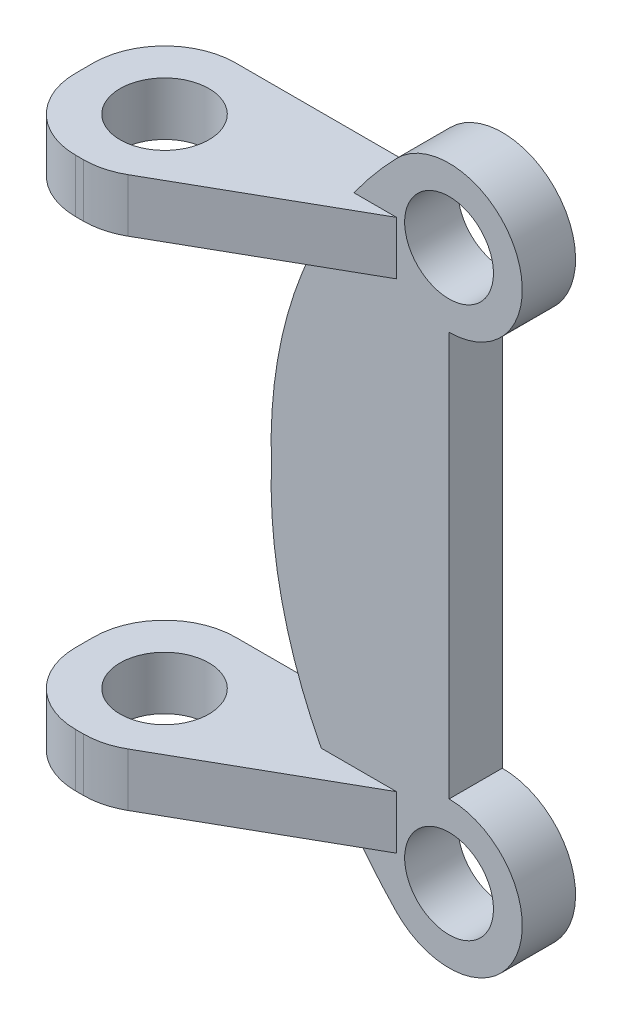
ISO-10303-21;
HEADER;
FILE_DESCRIPTION(('STEP AP214'),'2;1');
FILE_NAME('part.step','',(''),(''),'','','');
FILE_SCHEMA(('AUTOMOTIVE_DESIGN { 1 0 10303 214 1 1 1 1 }'));
ENDSEC;
DATA;
#1=APPLICATION_CONTEXT('core data for automotive mechanical design processes');
#2=APPLICATION_PROTOCOL_DEFINITION('international standard','automotive_design',2000,#1);
#3=PRODUCT_CONTEXT('',#1,'mechanical');
#4=PRODUCT('Part','Part','',(#3));
#5=PRODUCT_RELATED_PRODUCT_CATEGORY('part','',(#4));
#6=PRODUCT_DEFINITION_FORMATION('','',#4);
#7=PRODUCT_DEFINITION_CONTEXT('part definition',#1,'design');
#8=PRODUCT_DEFINITION('design','',#6,#7);
#9=PRODUCT_DEFINITION_SHAPE('','',#8);
#10=(LENGTH_UNIT() NAMED_UNIT(*) SI_UNIT(.MILLI.,.METRE.));
#11=(NAMED_UNIT(*) PLANE_ANGLE_UNIT() SI_UNIT($,.RADIAN.));
#12=(NAMED_UNIT(*) SI_UNIT($,.STERADIAN.) SOLID_ANGLE_UNIT());
#13=UNCERTAINTY_MEASURE_WITH_UNIT(LENGTH_MEASURE(1.E-05),#10,'distance_accuracy_value','');
#14=(GEOMETRIC_REPRESENTATION_CONTEXT(3) GLOBAL_UNCERTAINTY_ASSIGNED_CONTEXT((#13)) GLOBAL_UNIT_ASSIGNED_CONTEXT((#10,
#11,#12)) REPRESENTATION_CONTEXT('',''));
#15=CARTESIAN_POINT('',(0.,0.,0.));
#16=DIRECTION('',(0.,0.,1.));
#17=DIRECTION('',(1.,0.,0.));
#18=AXIS2_PLACEMENT_3D('',#15,#16,#17);
#19=CARTESIAN_POINT('',(0.,0.,3.));
#20=DIRECTION('',(0.,0.,1.));
#21=DIRECTION('',(1.,0.,0.));
#22=AXIS2_PLACEMENT_3D('',#19,#20,#21);
#23=PLANE('',#22);
#24=CARTESIAN_POINT('',(3.49295233502644,-16.0871406371406,3.));
#25=DIRECTION('',(0.,0.,1.));
#26=DIRECTION('',(1.,0.,0.));
#27=AXIS2_PLACEMENT_3D('',#24,#25,#26);
#28=CIRCLE('',#27,2.5);
#29=CARTESIAN_POINT('',(5.99295233502645,-16.0871406371406,3.));
#30=VERTEX_POINT('',#29);
#31=EDGE_CURVE('E345',#30,#30,#28,.T.);
#32=ORIENTED_EDGE('',*,*,#31,.F.);
#33=EDGE_LOOP('',(#32));
#34=FACE_BOUND('',#33,.T.);
#35=CARTESIAN_POINT('',(3.49295233502644,14.9128593628594,3.));
#36=DIRECTION('',(0.,0.,1.));
#37=DIRECTION('',(1.,0.,0.));
#38=AXIS2_PLACEMENT_3D('',#35,#36,#37);
#39=CIRCLE('',#38,2.5);
#40=CARTESIAN_POINT('',(5.99295233502645,14.9128593628594,3.));
#41=VERTEX_POINT('',#40);
#42=EDGE_CURVE('E348',#41,#41,#39,.T.);
#43=ORIENTED_EDGE('',*,*,#42,.F.);
#44=EDGE_LOOP('',(#43));
#45=FACE_BOUND('',#44,.T.);
#46=DIRECTION('',(0.,1.,0.));
#47=VECTOR('',#46,1.);
#48=CARTESIAN_POINT('',(0.534883590771744,-16.0871406371406,3.));
#49=LINE('',#48,#47);
#50=CARTESIAN_POINT('',(0.534883590771744,-16.0871406371407,3.));
#51=VERTEX_POINT('',#50);
#52=CARTESIAN_POINT('',(0.534883590771741,-13.0871406371406,3.));
#53=VERTEX_POINT('',#52);
#54=EDGE_CURVE('E48',#51,#53,#49,.T.);
#55=ORIENTED_EDGE('',*,*,#54,.F.);
#56=DIRECTION('',(-1.,0.,0.));
#57=VECTOR('',#56,1.);
#58=CARTESIAN_POINT('',(0.,-16.0871406371406,3.));
#59=LINE('',#58,#57);
#60=CARTESIAN_POINT('',(-1.86181712494155,-16.0871406371407,3.));
#61=VERTEX_POINT('',#60);
#62=EDGE_CURVE('E206',#51,#61,#59,.T.);
#63=ORIENTED_EDGE('',*,*,#62,.T.);
#64=CARTESIAN_POINT('',(18.4745416203069,-1.54642150139809,3.));
#65=DIRECTION('',(0.,0.,1.));
#66=DIRECTION('',(1.,0.,0.));
#67=AXIS2_PLACEMENT_3D('',#64,#65,#66);
#68=CIRCLE('',#67,24.9999999999999);
#69=CARTESIAN_POINT('',(0.534883590771748,-18.9581609258016,3.));
#70=VERTEX_POINT('',#69);
#71=EDGE_CURVE('E337',#70,#61,#68,.F.);
#72=ORIENTED_EDGE('',*,*,#71,.F.);
#73=CARTESIAN_POINT('',(3.49295233502644,-16.0871406371406,3.));
#74=DIRECTION('',(0.,0.,1.));
#75=DIRECTION('',(1.,0.,0.));
#76=AXIS2_PLACEMENT_3D('',#73,#74,#75);
#77=CIRCLE('',#76,4.12224795392507);
#78=CARTESIAN_POINT('',(3.49295233502644,-11.9648926832156,3.));
#79=VERTEX_POINT('',#78);
#80=EDGE_CURVE('E340',#70,#79,#77,.T.);
#81=ORIENTED_EDGE('',*,*,#80,.T.);
#82=DIRECTION('',(0.,-1.,0.));
#83=VECTOR('',#82,1.);
#84=CARTESIAN_POINT('',(3.49295233502644,0.,3.));
#85=LINE('',#84,#83);
#86=CARTESIAN_POINT('',(3.49295233502644,10.7906114089343,3.));
#87=VERTEX_POINT('',#86);
#88=EDGE_CURVE('E342',#87,#79,#85,.T.);
#89=ORIENTED_EDGE('',*,*,#88,.F.);
#90=CARTESIAN_POINT('',(3.49295233502644,14.9128593628594,3.));
#91=DIRECTION('',(0.,0.,1.));
#92=DIRECTION('',(1.,0.,0.));
#93=AXIS2_PLACEMENT_3D('',#90,#91,#92);
#94=CIRCLE('',#93,4.12224795392507);
#95=CARTESIAN_POINT('',(0.534883590771744,17.7838796515203,3.));
#96=VERTEX_POINT('',#95);
#97=EDGE_CURVE('E328',#96,#87,#94,.F.);
#98=ORIENTED_EDGE('',*,*,#97,.F.);
#99=CARTESIAN_POINT('',(18.4745416203069,0.372140227116786,3.));
#100=DIRECTION('',(0.,0.,1.));
#101=DIRECTION('',(1.,0.,0.));
#102=AXIS2_PLACEMENT_3D('',#99,#100,#101);
#103=CIRCLE('',#102,24.9999999999999);
#104=CARTESIAN_POINT('',(-1.86181712494155,14.9128593628593,3.));
#105=VERTEX_POINT('',#104);
#106=EDGE_CURVE('E333',#96,#105,#103,.T.);
#107=ORIENTED_EDGE('',*,*,#106,.T.);
#108=DIRECTION('',(1.,0.,0.));
#109=VECTOR('',#108,1.);
#110=CARTESIAN_POINT('',(0.,14.9128593628594,3.));
#111=LINE('',#110,#109);
#112=CARTESIAN_POINT('',(0.534883590771708,14.9128593628594,3.));
#113=VERTEX_POINT('',#112);
#114=EDGE_CURVE('E322',#105,#113,#111,.T.);
#115=ORIENTED_EDGE('',*,*,#114,.T.);
#116=DIRECTION('',(0.,-1.,0.));
#117=VECTOR('',#116,1.);
#118=CARTESIAN_POINT('',(0.534883590771708,14.9128593628594,3.));
#119=LINE('',#118,#117);
#120=CARTESIAN_POINT('',(0.534883590771712,11.9128593628593,3.));
#121=VERTEX_POINT('',#120);
#122=EDGE_CURVE('E283',#113,#121,#119,.T.);
#123=ORIENTED_EDGE('',*,*,#122,.T.);
#124=DIRECTION('',(1.,0.,0.));
#125=VECTOR('',#124,1.);
#126=CARTESIAN_POINT('',(0.,11.9128593628594,3.));
#127=LINE('',#126,#125);
#128=CARTESIAN_POINT('',(-3.70228867236339,11.9128593628593,3.));
#129=VERTEX_POINT('',#128);
#130=EDGE_CURVE('E316',#129,#121,#127,.T.);
#131=ORIENTED_EDGE('',*,*,#130,.F.);
#132=CARTESIAN_POINT('',(-6.50704720473508,-0.587140637140656,3.));
#133=VERTEX_POINT('',#132);
#134=EDGE_CURVE('E331',#129,#133,#103,.T.);
#135=ORIENTED_EDGE('',*,*,#134,.T.);
#136=CARTESIAN_POINT('',(-3.70228867236339,-13.0871406371407,3.));
#137=VERTEX_POINT('',#136);
#138=EDGE_CURVE('E336',#137,#133,#68,.F.);
#139=ORIENTED_EDGE('',*,*,#138,.F.);
#140=DIRECTION('',(-1.,0.,0.));
#141=VECTOR('',#140,1.);
#142=CARTESIAN_POINT('',(0.,-13.0871406371406,3.));
#143=LINE('',#142,#141);
#144=EDGE_CURVE('E53',#53,#137,#143,.T.);
#145=ORIENTED_EDGE('',*,*,#144,.F.);
#146=EDGE_LOOP('',(#55,#63,#72,#81,#89,#98,#107,#115,#123,#131,#135,#139,#145));
#147=FACE_BOUND('',#146,.T.);
#148=ADVANCED_FACE('F33',(#34,#45,#147),#23,.T.);
#149=CARTESIAN_POINT('',(18.4745416203069,-1.54642150139809,3.));
#150=DIRECTION('',(0.,0.,-1.));
#151=DIRECTION('',(-1.,0.,0.));
#152=AXIS2_PLACEMENT_3D('',#149,#150,#151);
#153=CYLINDRICAL_SURFACE('',#152,24.9999999999999);
#154=ORIENTED_EDGE('',*,*,#71,.T.);
#155=DIRECTION('',(0.,0.,-1.));
#156=VECTOR('',#155,1.);
#157=CARTESIAN_POINT('',(-1.86181712494156,-16.0871406371407,3.));
#158=LINE('',#157,#156);
#159=CARTESIAN_POINT('',(-1.86181712494156,-16.0871406371407,0.));
#160=VERTEX_POINT('',#159);
#161=EDGE_CURVE('E258',#61,#160,#158,.T.);
#162=ORIENTED_EDGE('',*,*,#161,.T.);
#163=CARTESIAN_POINT('',(18.4745416203069,-1.54642150139809,0.));
#164=DIRECTION('',(0.,0.,1.));
#165=DIRECTION('',(1.,0.,0.));
#166=AXIS2_PLACEMENT_3D('',#163,#164,#165);
#167=CIRCLE('',#166,24.9999999999999);
#168=CARTESIAN_POINT('',(0.534883590771748,-18.9581609258016,0.));
#169=VERTEX_POINT('',#168);
#170=EDGE_CURVE('E359',#169,#160,#167,.F.);
#171=ORIENTED_EDGE('',*,*,#170,.F.);
#172=DIRECTION('',(0.,0.,-1.));
#173=VECTOR('',#172,1.);
#174=CARTESIAN_POINT('',(0.534883590771748,-18.9581609258016,3.));
#175=LINE('',#174,#173);
#176=EDGE_CURVE('E376',#70,#169,#175,.T.);
#177=ORIENTED_EDGE('',*,*,#176,.F.);
#178=EDGE_LOOP('',(#154,#162,#171,#177));
#179=FACE_BOUND('',#178,.T.);
#180=ADVANCED_FACE('F438',(#179),#153,.T.);
#181=CARTESIAN_POINT('',(18.4745416203069,0.372140227116786,3.));
#182=DIRECTION('',(0.,0.,-1.));
#183=DIRECTION('',(-1.,0.,0.));
#184=AXIS2_PLACEMENT_3D('',#181,#182,#183);
#185=CYLINDRICAL_SURFACE('',#184,24.9999999999999);
#186=DIRECTION('',(0.,0.,-1.));
#187=VECTOR('',#186,1.);
#188=CARTESIAN_POINT('',(-1.86181712494155,14.9128593628593,3.));
#189=LINE('',#188,#187);
#190=CARTESIAN_POINT('',(-1.86181712494155,14.9128593628593,0.));
#191=VERTEX_POINT('',#190);
#192=EDGE_CURVE('E325',#105,#191,#189,.T.);
#193=ORIENTED_EDGE('',*,*,#192,.F.);
#194=ORIENTED_EDGE('',*,*,#106,.F.);
#195=DIRECTION('',(0.,0.,-1.));
#196=VECTOR('',#195,1.);
#197=CARTESIAN_POINT('',(0.534883590771744,17.7838796515203,3.));
#198=LINE('',#197,#196);
#199=CARTESIAN_POINT('',(0.534883590771744,17.7838796515203,0.));
#200=VERTEX_POINT('',#199);
#201=EDGE_CURVE('E11',#96,#200,#198,.T.);
#202=ORIENTED_EDGE('',*,*,#201,.T.);
#203=CARTESIAN_POINT('',(18.4745416203069,0.372140227116786,0.));
#204=DIRECTION('',(0.,0.,1.));
#205=DIRECTION('',(1.,0.,0.));
#206=AXIS2_PLACEMENT_3D('',#203,#204,#205);
#207=CIRCLE('',#206,24.9999999999999);
#208=EDGE_CURVE('E355',#200,#191,#207,.T.);
#209=ORIENTED_EDGE('',*,*,#208,.T.);
#210=EDGE_LOOP('',(#193,#194,#202,#209));
#211=FACE_BOUND('',#210,.T.);
#212=ADVANCED_FACE('F422',(#211),#185,.T.);
#213=CARTESIAN_POINT('',(3.49295233502644,14.9128593628594,3.));
#214=DIRECTION('',(0.,0.,-1.));
#215=DIRECTION('',(-1.,0.,0.));
#216=AXIS2_PLACEMENT_3D('',#213,#214,#215);
#217=CYLINDRICAL_SURFACE('',#216,4.12224795392507);
#218=CARTESIAN_POINT('',(3.49295233502644,14.9128593628594,0.));
#219=DIRECTION('',(0.,0.,1.));
#220=DIRECTION('',(1.,0.,0.));
#221=AXIS2_PLACEMENT_3D('',#218,#219,#220);
#222=CIRCLE('',#221,4.12224795392507);
#223=CARTESIAN_POINT('',(3.49295233502644,10.7906114089343,0.));
#224=VERTEX_POINT('',#223);
#225=EDGE_CURVE('E327',#200,#224,#222,.F.);
#226=ORIENTED_EDGE('',*,*,#225,.F.);
#227=ORIENTED_EDGE('',*,*,#201,.F.);
#228=ORIENTED_EDGE('',*,*,#97,.T.);
#229=DIRECTION('',(0.,0.,-1.));
#230=VECTOR('',#229,1.);
#231=CARTESIAN_POINT('',(3.49295233502644,10.7906114089343,3.));
#232=LINE('',#231,#230);
#233=EDGE_CURVE('E351',#87,#224,#232,.T.);
#234=ORIENTED_EDGE('',*,*,#233,.T.);
#235=EDGE_LOOP('',(#226,#227,#228,#234));
#236=FACE_BOUND('',#235,.T.);
#237=ADVANCED_FACE('F35',(#236),#217,.T.);
#238=ORIENTED_EDGE('',*,*,#134,.F.);
#239=DIRECTION('',(0.,0.,-1.));
#240=VECTOR('',#239,1.);
#241=CARTESIAN_POINT('',(-3.70228867236339,11.9128593628593,3.));
#242=LINE('',#241,#240);
#243=CARTESIAN_POINT('',(-3.70228867236339,11.9128593628593,0.));
#244=VERTEX_POINT('',#243);
#245=EDGE_CURVE('E319',#129,#244,#242,.T.);
#246=ORIENTED_EDGE('',*,*,#245,.T.);
#247=CARTESIAN_POINT('',(-6.50704720473508,-0.587140637140656,0.));
#248=VERTEX_POINT('',#247);
#249=EDGE_CURVE('E354',#244,#248,#207,.T.);
#250=ORIENTED_EDGE('',*,*,#249,.T.);
#251=DIRECTION('',(0.,0.,-1.));
#252=VECTOR('',#251,1.);
#253=CARTESIAN_POINT('',(-6.50704720473508,-0.587140637140656,3.));
#254=LINE('',#253,#252);
#255=EDGE_CURVE('E41',#133,#248,#254,.T.);
#256=ORIENTED_EDGE('',*,*,#255,.F.);
#257=EDGE_LOOP('',(#238,#246,#250,#256));
#258=FACE_BOUND('',#257,.T.);
#259=ADVANCED_FACE('F385',(#258),#185,.T.);
#260=DIRECTION('',(0.,0.,-1.));
#261=VECTOR('',#260,1.);
#262=CARTESIAN_POINT('',(-3.70228867236339,-13.0871406371407,3.));
#263=LINE('',#262,#261);
#264=CARTESIAN_POINT('',(-3.70228867236339,-13.0871406371407,0.));
#265=VERTEX_POINT('',#264);
#266=EDGE_CURVE('E254',#137,#265,#263,.T.);
#267=ORIENTED_EDGE('',*,*,#266,.F.);
#268=ORIENTED_EDGE('',*,*,#138,.T.);
#269=ORIENTED_EDGE('',*,*,#255,.T.);
#270=EDGE_CURVE('E358',#265,#248,#167,.F.);
#271=ORIENTED_EDGE('',*,*,#270,.F.);
#272=EDGE_LOOP('',(#267,#268,#269,#271));
#273=FACE_BOUND('',#272,.T.);
#274=ADVANCED_FACE('F380',(#273),#153,.T.);
#275=CARTESIAN_POINT('',(3.49295233502644,-16.0871406371406,3.));
#276=DIRECTION('',(0.,0.,-1.));
#277=DIRECTION('',(-1.,0.,0.));
#278=AXIS2_PLACEMENT_3D('',#275,#276,#277);
#279=CYLINDRICAL_SURFACE('',#278,4.12224795392507);
#280=CARTESIAN_POINT('',(3.49295233502644,-16.0871406371406,0.));
#281=DIRECTION('',(0.,0.,1.));
#282=DIRECTION('',(1.,0.,0.));
#283=AXIS2_PLACEMENT_3D('',#280,#281,#282);
#284=CIRCLE('',#283,4.12224795392507);
#285=CARTESIAN_POINT('',(3.49295233502644,-11.9648926832156,0.));
#286=VERTEX_POINT('',#285);
#287=EDGE_CURVE('E362',#169,#286,#284,.T.);
#288=ORIENTED_EDGE('',*,*,#287,.T.);
#289=DIRECTION('',(0.,0.,-1.));
#290=VECTOR('',#289,1.);
#291=CARTESIAN_POINT('',(3.49295233502644,-11.9648926832156,3.));
#292=LINE('',#291,#290);
#293=EDGE_CURVE('E374',#79,#286,#292,.T.);
#294=ORIENTED_EDGE('',*,*,#293,.F.);
#295=ORIENTED_EDGE('',*,*,#80,.F.);
#296=ORIENTED_EDGE('',*,*,#176,.T.);
#297=EDGE_LOOP('',(#288,#294,#295,#296));
#298=FACE_BOUND('',#297,.T.);
#299=ADVANCED_FACE('F434',(#298),#279,.T.);
#300=CARTESIAN_POINT('',(3.49295233502644,-16.0871406371406,3.));
#301=DIRECTION('',(0.,0.,-1.));
#302=DIRECTION('',(-1.,0.,0.));
#303=AXIS2_PLACEMENT_3D('',#300,#301,#302);
#304=CYLINDRICAL_SURFACE('',#303,2.5);
#305=ORIENTED_EDGE('',*,*,#31,.T.);
#306=EDGE_LOOP('',(#305));
#307=FACE_BOUND('',#306,.T.);
#308=CARTESIAN_POINT('',(3.49295233502644,-16.0871406371406,0.));
#309=DIRECTION('',(0.,0.,1.));
#310=DIRECTION('',(1.,0.,0.));
#311=AXIS2_PLACEMENT_3D('',#308,#309,#310);
#312=CIRCLE('',#311,2.5);
#313=CARTESIAN_POINT('',(5.99295233502645,-16.0871406371406,0.));
#314=VERTEX_POINT('',#313);
#315=EDGE_CURVE('E368',#314,#314,#312,.T.);
#316=ORIENTED_EDGE('',*,*,#315,.F.);
#317=EDGE_LOOP('',(#316));
#318=FACE_BOUND('',#317,.T.);
#319=ADVANCED_FACE('F480',(#307,#318),#304,.F.);
#320=CARTESIAN_POINT('',(3.49295233502644,0.,3.));
#321=DIRECTION('',(1.,0.,0.));
#322=DIRECTION('',(0.,0.,-1.));
#323=AXIS2_PLACEMENT_3D('',#320,#321,#322);
#324=PLANE('',#323);
#325=DIRECTION('',(0.,-1.,0.));
#326=VECTOR('',#325,1.);
#327=CARTESIAN_POINT('',(3.49295233502644,0.,0.));
#328=LINE('',#327,#326);
#329=EDGE_CURVE('E365',#224,#286,#328,.T.);
#330=ORIENTED_EDGE('',*,*,#329,.F.);
#331=ORIENTED_EDGE('',*,*,#233,.F.);
#332=ORIENTED_EDGE('',*,*,#88,.T.);
#333=ORIENTED_EDGE('',*,*,#293,.T.);
#334=EDGE_LOOP('',(#330,#331,#332,#333));
#335=FACE_BOUND('',#334,.T.);
#336=ADVANCED_FACE('F430',(#335),#324,.T.);
#337=CARTESIAN_POINT('',(3.49295233502644,14.9128593628594,3.));
#338=DIRECTION('',(0.,0.,-1.));
#339=DIRECTION('',(-1.,0.,0.));
#340=AXIS2_PLACEMENT_3D('',#337,#338,#339);
#341=CYLINDRICAL_SURFACE('',#340,2.5);
#342=ORIENTED_EDGE('',*,*,#42,.T.);
#343=EDGE_LOOP('',(#342));
#344=FACE_BOUND('',#343,.T.);
#345=CARTESIAN_POINT('',(3.49295233502644,14.9128593628594,0.));
#346=DIRECTION('',(0.,0.,1.));
#347=DIRECTION('',(1.,0.,0.));
#348=AXIS2_PLACEMENT_3D('',#345,#346,#347);
#349=CIRCLE('',#348,2.5);
#350=CARTESIAN_POINT('',(5.99295233502645,14.9128593628594,0.));
#351=VERTEX_POINT('',#350);
#352=EDGE_CURVE('E332',#351,#351,#349,.T.);
#353=ORIENTED_EDGE('',*,*,#352,.F.);
#354=EDGE_LOOP('',(#353));
#355=FACE_BOUND('',#354,.T.);
#356=ADVANCED_FACE('F476',(#344,#355),#341,.F.);
#357=CARTESIAN_POINT('',(0.,0.,0.));
#358=DIRECTION('',(0.,0.,1.));
#359=DIRECTION('',(1.,0.,0.));
#360=AXIS2_PLACEMENT_3D('',#357,#358,#359);
#361=PLANE('',#360);
#362=ORIENTED_EDGE('',*,*,#170,.T.);
#363=DIRECTION('',(-1.,0.,0.));
#364=VECTOR('',#363,1.);
#365=CARTESIAN_POINT('',(-11.5254583796929,-16.0871406371407,0.));
#366=LINE('',#365,#364);
#367=CARTESIAN_POINT('',(-11.5254583796929,-16.0871406371407,0.));
#368=VERTEX_POINT('',#367);
#369=EDGE_CURVE('E224',#160,#368,#366,.T.);
#370=ORIENTED_EDGE('',*,*,#369,.T.);
#371=DIRECTION('',(0.,1.,0.));
#372=VECTOR('',#371,1.);
#373=CARTESIAN_POINT('',(-11.5254583796929,-16.0871406371407,0.));
#374=LINE('',#373,#372);
#375=CARTESIAN_POINT('',(-11.5254583796929,-13.0871406371407,0.));
#376=VERTEX_POINT('',#375);
#377=EDGE_CURVE('E226',#368,#376,#374,.T.);
#378=ORIENTED_EDGE('',*,*,#377,.T.);
#379=DIRECTION('',(-1.,0.,0.));
#380=VECTOR('',#379,1.);
#381=CARTESIAN_POINT('',(-11.5254583796929,-13.0871406371407,0.));
#382=LINE('',#381,#380);
#383=EDGE_CURVE('E207',#265,#376,#382,.T.);
#384=ORIENTED_EDGE('',*,*,#383,.F.);
#385=ORIENTED_EDGE('',*,*,#270,.T.);
#386=ORIENTED_EDGE('',*,*,#249,.F.);
#387=DIRECTION('',(-1.,0.,0.));
#388=VECTOR('',#387,1.);
#389=CARTESIAN_POINT('',(-11.525458379693,11.9128593628593,0.));
#390=LINE('',#389,#388);
#391=CARTESIAN_POINT('',(-11.525458379693,11.9128593628593,0.));
#392=VERTEX_POINT('',#391);
#393=EDGE_CURVE('E265',#244,#392,#390,.T.);
#394=ORIENTED_EDGE('',*,*,#393,.T.);
#395=DIRECTION('',(0.,-1.,0.));
#396=VECTOR('',#395,1.);
#397=CARTESIAN_POINT('',(-11.525458379693,14.9128593628593,0.));
#398=LINE('',#397,#396);
#399=CARTESIAN_POINT('',(-11.525458379693,14.9128593628593,0.));
#400=VERTEX_POINT('',#399);
#401=EDGE_CURVE('E313',#400,#392,#398,.T.);
#402=ORIENTED_EDGE('',*,*,#401,.F.);
#403=DIRECTION('',(-1.,0.,0.));
#404=VECTOR('',#403,1.);
#405=CARTESIAN_POINT('',(-11.525458379693,14.9128593628593,0.));
#406=LINE('',#405,#404);
#407=EDGE_CURVE('E268',#191,#400,#406,.T.);
#408=ORIENTED_EDGE('',*,*,#407,.F.);
#409=ORIENTED_EDGE('',*,*,#208,.F.);
#410=ORIENTED_EDGE('',*,*,#225,.T.);
#411=ORIENTED_EDGE('',*,*,#329,.T.);
#412=ORIENTED_EDGE('',*,*,#287,.F.);
#413=EDGE_LOOP('',(#362,#370,#378,#384,#385,#386,#394,#402,#408,#409,#410,#411,#412));
#414=FACE_BOUND('',#413,.T.);
#415=ORIENTED_EDGE('',*,*,#315,.T.);
#416=EDGE_LOOP('',(#415));
#417=FACE_BOUND('',#416,.T.);
#418=ORIENTED_EDGE('',*,*,#352,.T.);
#419=EDGE_LOOP('',(#418));
#420=FACE_BOUND('',#419,.T.);
#421=ADVANCED_FACE('F388',(#414,#417,#420),#361,.F.);
#422=CARTESIAN_POINT('',(-11.525458379693,14.9128593628593,4.));
#423=DIRECTION('',(0.,-1.,0.));
#424=DIRECTION('',(1.,0.,0.));
#425=AXIS2_PLACEMENT_3D('',#422,#423,#424);
#426=PLANE('',#425);
#427=CARTESIAN_POINT('',(-11.025458379693,14.9128593628593,4.5));
#428=DIRECTION('',(0.,1.,0.));
#429=DIRECTION('',(-1.,0.,0.));
#430=AXIS2_PLACEMENT_3D('',#427,#428,#429);
#431=CIRCLE('',#430,2.5);
#432=CARTESIAN_POINT('',(-13.525458379693,14.9128593628593,4.5));
#433=VERTEX_POINT('',#432);
#434=EDGE_CURVE('E262',#433,#433,#431,.T.);
#435=ORIENTED_EDGE('',*,*,#434,.F.);
#436=EDGE_LOOP('',(#435));
#437=FACE_BOUND('',#436,.T.);
#438=ORIENTED_EDGE('',*,*,#114,.F.);
#439=ORIENTED_EDGE('',*,*,#192,.T.);
#440=ORIENTED_EDGE('',*,*,#407,.T.);
#441=CARTESIAN_POINT('',(-11.525458379693,14.9128593628593,4.));
#442=DIRECTION('',(0.,1.,0.));
#443=DIRECTION('',(1.,0.,0.));
#444=AXIS2_PLACEMENT_3D('',#441,#442,#443);
#445=CIRCLE('',#444,4.);
#446=CARTESIAN_POINT('',(-15.525458379693,14.9128593628593,4.));
#447=VERTEX_POINT('',#446);
#448=EDGE_CURVE('E270',#400,#447,#445,.T.);
#449=ORIENTED_EDGE('',*,*,#448,.T.);
#450=DIRECTION('',(0.,0.,1.));
#451=VECTOR('',#450,1.);
#452=CARTESIAN_POINT('',(-15.525458379693,14.9128593628593,5.));
#453=LINE('',#452,#451);
#454=CARTESIAN_POINT('',(-15.525458379693,14.9128593628593,5.));
#455=VERTEX_POINT('',#454);
#456=EDGE_CURVE('E273',#447,#455,#453,.T.);
#457=ORIENTED_EDGE('',*,*,#456,.T.);
#458=CARTESIAN_POINT('',(-11.525458379693,14.9128593628593,5.));
#459=DIRECTION('',(0.,1.,0.));
#460=DIRECTION('',(1.,0.,0.));
#461=AXIS2_PLACEMENT_3D('',#458,#459,#460);
#462=CIRCLE('',#461,4.);
#463=CARTESIAN_POINT('',(-11.525458379693,14.9128593628593,9.));
#464=VERTEX_POINT('',#463);
#465=EDGE_CURVE('E275',#455,#464,#462,.T.);
#466=ORIENTED_EDGE('',*,*,#465,.T.);
#467=DIRECTION('',(1.,0.,0.));
#468=VECTOR('',#467,1.);
#469=CARTESIAN_POINT('',(-11.0824404136249,14.9128593628593,9.));
#470=LINE('',#469,#468);
#471=CARTESIAN_POINT('',(-11.0824404136249,14.9128593628593,9.));
#472=VERTEX_POINT('',#471);
#473=EDGE_CURVE('E277',#464,#472,#470,.T.);
#474=ORIENTED_EDGE('',*,*,#473,.T.);
#475=CARTESIAN_POINT('',(-11.0824404136249,14.9128593628593,5.));
#476=DIRECTION('',(0.,1.,0.));
#477=DIRECTION('',(1.,0.,0.));
#478=AXIS2_PLACEMENT_3D('',#475,#476,#477);
#479=CIRCLE('',#478,4.);
#480=CARTESIAN_POINT('',(-9.10645115660202,14.9128593628593,8.47785371402105));
#481=VERTEX_POINT('',#480);
#482=EDGE_CURVE('E279',#472,#481,#479,.T.);
#483=ORIENTED_EDGE('',*,*,#482,.T.);
#484=DIRECTION('',(0.869463428505264,0.,-0.493997314255727));
#485=VECTOR('',#484,1.);
#486=CARTESIAN_POINT('',(0.534883590771708,14.9128593628594,3.));
#487=LINE('',#486,#485);
#488=EDGE_CURVE('E281',#481,#113,#487,.T.);
#489=ORIENTED_EDGE('',*,*,#488,.T.);
#490=EDGE_LOOP('',(#438,#439,#440,#449,#457,#466,#474,#483,#489));
#491=FACE_BOUND('',#490,.T.);
#492=ADVANCED_FACE('F415',(#437,#491),#426,.F.);
#493=CARTESIAN_POINT('',(-11.525458379693,11.9128593628593,4.));
#494=DIRECTION('',(0.,-1.,0.));
#495=DIRECTION('',(1.,0.,0.));
#496=AXIS2_PLACEMENT_3D('',#493,#494,#495);
#497=PLANE('',#496);
#498=CARTESIAN_POINT('',(-11.025458379693,11.9128593628593,4.5));
#499=DIRECTION('',(0.,1.,0.));
#500=DIRECTION('',(-1.,0.,0.));
#501=AXIS2_PLACEMENT_3D('',#498,#499,#500);
#502=CIRCLE('',#501,2.5);
#503=CARTESIAN_POINT('',(-13.525458379693,11.9128593628593,4.5));
#504=VERTEX_POINT('',#503);
#505=EDGE_CURVE('E261',#504,#504,#502,.T.);
#506=ORIENTED_EDGE('',*,*,#505,.T.);
#507=EDGE_LOOP('',(#506));
#508=FACE_BOUND('',#507,.T.);
#509=ORIENTED_EDGE('',*,*,#245,.F.);
#510=ORIENTED_EDGE('',*,*,#130,.T.);
#511=DIRECTION('',(0.869463428505264,0.,-0.493997314255727));
#512=VECTOR('',#511,1.);
#513=CARTESIAN_POINT('',(0.534883590771712,11.9128593628594,3.));
#514=LINE('',#513,#512);
#515=CARTESIAN_POINT('',(-9.10645115660202,11.9128593628593,8.47785371402105));
#516=VERTEX_POINT('',#515);
#517=EDGE_CURVE('E271',#516,#121,#514,.T.);
#518=ORIENTED_EDGE('',*,*,#517,.F.);
#519=CARTESIAN_POINT('',(-11.0824404136249,11.9128593628593,5.));
#520=DIRECTION('',(0.,1.,0.));
#521=DIRECTION('',(1.,0.,0.));
#522=AXIS2_PLACEMENT_3D('',#519,#520,#521);
#523=CIRCLE('',#522,4.);
#524=CARTESIAN_POINT('',(-11.0824404136249,11.9128593628593,9.));
#525=VERTEX_POINT('',#524);
#526=EDGE_CURVE('E293',#525,#516,#523,.T.);
#527=ORIENTED_EDGE('',*,*,#526,.F.);
#528=DIRECTION('',(1.,0.,0.));
#529=VECTOR('',#528,1.);
#530=CARTESIAN_POINT('',(-11.0824404136249,11.9128593628593,9.));
#531=LINE('',#530,#529);
#532=CARTESIAN_POINT('',(-11.525458379693,11.9128593628593,9.));
#533=VERTEX_POINT('',#532);
#534=EDGE_CURVE('E291',#533,#525,#531,.T.);
#535=ORIENTED_EDGE('',*,*,#534,.F.);
#536=CARTESIAN_POINT('',(-11.525458379693,11.9128593628593,5.));
#537=DIRECTION('',(0.,1.,0.));
#538=DIRECTION('',(1.,0.,0.));
#539=AXIS2_PLACEMENT_3D('',#536,#537,#538);
#540=CIRCLE('',#539,4.);
#541=CARTESIAN_POINT('',(-15.525458379693,11.9128593628593,5.));
#542=VERTEX_POINT('',#541);
#543=EDGE_CURVE('E289',#542,#533,#540,.T.);
#544=ORIENTED_EDGE('',*,*,#543,.F.);
#545=DIRECTION('',(0.,0.,1.));
#546=VECTOR('',#545,1.);
#547=CARTESIAN_POINT('',(-15.525458379693,11.9128593628593,5.));
#548=LINE('',#547,#546);
#549=CARTESIAN_POINT('',(-15.525458379693,11.9128593628593,4.));
#550=VERTEX_POINT('',#549);
#551=EDGE_CURVE('E287',#550,#542,#548,.T.);
#552=ORIENTED_EDGE('',*,*,#551,.F.);
#553=CARTESIAN_POINT('',(-11.525458379693,11.9128593628593,4.));
#554=DIRECTION('',(0.,1.,0.));
#555=DIRECTION('',(1.,0.,0.));
#556=AXIS2_PLACEMENT_3D('',#553,#554,#555);
#557=CIRCLE('',#556,4.);
#558=EDGE_CURVE('E285',#392,#550,#557,.T.);
#559=ORIENTED_EDGE('',*,*,#558,.F.);
#560=ORIENTED_EDGE('',*,*,#393,.F.);
#561=EDGE_LOOP('',(#509,#510,#518,#527,#535,#544,#552,#559,#560));
#562=FACE_BOUND('',#561,.T.);
#563=ADVANCED_FACE('F400',(#508,#562),#497,.T.);
#564=CARTESIAN_POINT('',(-11.525458379693,14.9128593628593,4.));
#565=DIRECTION('',(0.,-1.,0.));
#566=DIRECTION('',(1.,0.,0.));
#567=AXIS2_PLACEMENT_3D('',#564,#565,#566);
#568=CYLINDRICAL_SURFACE('',#567,4.);
#569=ORIENTED_EDGE('',*,*,#558,.T.);
#570=DIRECTION('',(0.,-1.,0.));
#571=VECTOR('',#570,1.);
#572=CARTESIAN_POINT('',(-15.525458379693,14.9128593628593,4.));
#573=LINE('',#572,#571);
#574=EDGE_CURVE('E310',#447,#550,#573,.T.);
#575=ORIENTED_EDGE('',*,*,#574,.F.);
#576=ORIENTED_EDGE('',*,*,#448,.F.);
#577=ORIENTED_EDGE('',*,*,#401,.T.);
#578=EDGE_LOOP('',(#569,#575,#576,#577));
#579=FACE_BOUND('',#578,.T.);
#580=ADVANCED_FACE('F407',(#579),#568,.T.);
#581=CARTESIAN_POINT('',(-15.525458379693,14.9128593628593,5.));
#582=DIRECTION('',(1.,0.,0.));
#583=DIRECTION('',(0.,1.,0.));
#584=AXIS2_PLACEMENT_3D('',#581,#582,#583);
#585=PLANE('',#584);
#586=ORIENTED_EDGE('',*,*,#551,.T.);
#587=DIRECTION('',(0.,-1.,0.));
#588=VECTOR('',#587,1.);
#589=CARTESIAN_POINT('',(-15.525458379693,14.9128593628593,5.));
#590=LINE('',#589,#588);
#591=EDGE_CURVE('E307',#455,#542,#590,.T.);
#592=ORIENTED_EDGE('',*,*,#591,.F.);
#593=ORIENTED_EDGE('',*,*,#456,.F.);
#594=ORIENTED_EDGE('',*,*,#574,.T.);
#595=EDGE_LOOP('',(#586,#592,#593,#594));
#596=FACE_BOUND('',#595,.T.);
#597=ADVANCED_FACE('F411',(#596),#585,.F.);
#598=CARTESIAN_POINT('',(-11.525458379693,14.9128593628593,5.));
#599=DIRECTION('',(0.,-1.,0.));
#600=DIRECTION('',(1.,0.,0.));
#601=AXIS2_PLACEMENT_3D('',#598,#599,#600);
#602=CYLINDRICAL_SURFACE('',#601,4.);
#603=ORIENTED_EDGE('',*,*,#543,.T.);
#604=DIRECTION('',(0.,-1.,0.));
#605=VECTOR('',#604,1.);
#606=CARTESIAN_POINT('',(-11.525458379693,14.9128593628593,9.));
#607=LINE('',#606,#605);
#608=EDGE_CURVE('E304',#464,#533,#607,.T.);
#609=ORIENTED_EDGE('',*,*,#608,.F.);
#610=ORIENTED_EDGE('',*,*,#465,.F.);
#611=ORIENTED_EDGE('',*,*,#591,.T.);
#612=EDGE_LOOP('',(#603,#609,#610,#611));
#613=FACE_BOUND('',#612,.T.);
#614=ADVANCED_FACE('F562',(#613),#602,.T.);
#615=CARTESIAN_POINT('',(-11.0824404136249,14.9128593628593,9.));
#616=DIRECTION('',(0.,0.,-1.));
#617=DIRECTION('',(-1.,0.,0.));
#618=AXIS2_PLACEMENT_3D('',#615,#616,#617);
#619=PLANE('',#618);
#620=ORIENTED_EDGE('',*,*,#534,.T.);
#621=DIRECTION('',(0.,-1.,0.));
#622=VECTOR('',#621,1.);
#623=CARTESIAN_POINT('',(-11.0824404136249,14.9128593628593,9.));
#624=LINE('',#623,#622);
#625=EDGE_CURVE('E301',#472,#525,#624,.T.);
#626=ORIENTED_EDGE('',*,*,#625,.F.);
#627=ORIENTED_EDGE('',*,*,#473,.F.);
#628=ORIENTED_EDGE('',*,*,#608,.T.);
#629=EDGE_LOOP('',(#620,#626,#627,#628));
#630=FACE_BOUND('',#629,.T.);
#631=ADVANCED_FACE('F568',(#630),#619,.F.);
#632=CARTESIAN_POINT('',(-11.0824404136249,14.9128593628593,5.));
#633=DIRECTION('',(0.,-1.,0.));
#634=DIRECTION('',(1.,0.,0.));
#635=AXIS2_PLACEMENT_3D('',#632,#633,#634);
#636=CYLINDRICAL_SURFACE('',#635,4.);
#637=ORIENTED_EDGE('',*,*,#526,.T.);
#638=DIRECTION('',(0.,-1.,0.));
#639=VECTOR('',#638,1.);
#640=CARTESIAN_POINT('',(-9.10645115660202,14.9128593628593,8.47785371402105));
#641=LINE('',#640,#639);
#642=EDGE_CURVE('E298',#481,#516,#641,.T.);
#643=ORIENTED_EDGE('',*,*,#642,.F.);
#644=ORIENTED_EDGE('',*,*,#482,.F.);
#645=ORIENTED_EDGE('',*,*,#625,.T.);
#646=EDGE_LOOP('',(#637,#643,#644,#645));
#647=FACE_BOUND('',#646,.T.);
#648=ADVANCED_FACE('F576',(#647),#636,.T.);
#649=CARTESIAN_POINT('',(0.534883590771708,14.9128593628594,3.));
#650=DIRECTION('',(-0.493997314255727,0.,-0.869463428505264));
#651=DIRECTION('',(-0.869463428505264,0.,0.493997314255727));
#652=AXIS2_PLACEMENT_3D('',#649,#650,#651);
#653=PLANE('',#652);
#654=ORIENTED_EDGE('',*,*,#517,.T.);
#655=ORIENTED_EDGE('',*,*,#122,.F.);
#656=ORIENTED_EDGE('',*,*,#488,.F.);
#657=ORIENTED_EDGE('',*,*,#642,.T.);
#658=EDGE_LOOP('',(#654,#655,#656,#657));
#659=FACE_BOUND('',#658,.T.);
#660=ADVANCED_FACE('F584',(#659),#653,.F.);
#661=CARTESIAN_POINT('',(-11.025458379693,14.9128593628593,4.5));
#662=DIRECTION('',(0.,-1.,0.));
#663=DIRECTION('',(1.,0.,0.));
#664=AXIS2_PLACEMENT_3D('',#661,#662,#663);
#665=CYLINDRICAL_SURFACE('',#664,2.5);
#666=ORIENTED_EDGE('',*,*,#434,.T.);
#667=EDGE_LOOP('',(#666));
#668=FACE_BOUND('',#667,.T.);
#669=ORIENTED_EDGE('',*,*,#505,.F.);
#670=EDGE_LOOP('',(#669));
#671=FACE_BOUND('',#670,.T.);
#672=ADVANCED_FACE('F592',(#668,#671),#665,.F.);
#673=CARTESIAN_POINT('',(0.534883590771744,-16.0871406371406,3.));
#674=DIRECTION('',(0.493997314255727,0.,0.869463428505264));
#675=DIRECTION('',(0.869463428505264,0.,-0.493997314255727));
#676=AXIS2_PLACEMENT_3D('',#673,#674,#675);
#677=PLANE('',#676);
#678=DIRECTION('',(0.869463428505264,0.,-0.493997314255727));
#679=VECTOR('',#678,1.);
#680=CARTESIAN_POINT('',(0.534883590771741,-13.0871406371406,3.));
#681=LINE('',#680,#679);
#682=CARTESIAN_POINT('',(-9.10645115660199,-13.0871406371407,8.47785371402105));
#683=VERTEX_POINT('',#682);
#684=EDGE_CURVE('E191',#683,#53,#681,.T.);
#685=ORIENTED_EDGE('',*,*,#684,.F.);
#686=DIRECTION('',(0.,1.,0.));
#687=VECTOR('',#686,1.);
#688=CARTESIAN_POINT('',(-9.10645115660198,-16.0871406371407,8.47785371402105));
#689=LINE('',#688,#687);
#690=CARTESIAN_POINT('',(-9.10645115660198,-16.0871406371407,8.47785371402105));
#691=VERTEX_POINT('',#690);
#692=EDGE_CURVE('E186',#691,#683,#689,.T.);
#693=ORIENTED_EDGE('',*,*,#692,.F.);
#694=DIRECTION('',(0.869463428505264,0.,-0.493997314255727));
#695=VECTOR('',#694,1.);
#696=CARTESIAN_POINT('',(0.534883590771744,-16.0871406371406,3.));
#697=LINE('',#696,#695);
#698=EDGE_CURVE('E189',#691,#51,#697,.T.);
#699=ORIENTED_EDGE('',*,*,#698,.T.);
#700=ORIENTED_EDGE('',*,*,#54,.T.);
#701=EDGE_LOOP('',(#685,#693,#699,#700));
#702=FACE_BOUND('',#701,.T.);
#703=ADVANCED_FACE('F188',(#702),#677,.T.);
#704=CARTESIAN_POINT('',(-11.0824404136249,-16.0871406371407,5.));
#705=DIRECTION('',(0.,1.,0.));
#706=DIRECTION('',(-1.,0.,0.));
#707=AXIS2_PLACEMENT_3D('',#704,#705,#706);
#708=CYLINDRICAL_SURFACE('',#707,4.);
#709=CARTESIAN_POINT('',(-11.0824404136249,-13.0871406371407,5.));
#710=DIRECTION('',(0.,1.,0.));
#711=DIRECTION('',(1.,0.,0.));
#712=AXIS2_PLACEMENT_3D('',#709,#710,#711);
#713=CIRCLE('',#712,4.);
#714=CARTESIAN_POINT('',(-11.0824404136249,-13.0871406371407,9.));
#715=VERTEX_POINT('',#714);
#716=EDGE_CURVE('E228',#715,#683,#713,.T.);
#717=ORIENTED_EDGE('',*,*,#716,.F.);
#718=DIRECTION('',(0.,1.,0.));
#719=VECTOR('',#718,1.);
#720=CARTESIAN_POINT('',(-11.0824404136249,-16.0871406371407,9.));
#721=LINE('',#720,#719);
#722=CARTESIAN_POINT('',(-11.0824404136249,-16.0871406371407,9.));
#723=VERTEX_POINT('',#722);
#724=EDGE_CURVE('E196',#723,#715,#721,.T.);
#725=ORIENTED_EDGE('',*,*,#724,.F.);
#726=CARTESIAN_POINT('',(-11.0824404136249,-16.0871406371407,5.));
#727=DIRECTION('',(0.,1.,0.));
#728=DIRECTION('',(1.,0.,0.));
#729=AXIS2_PLACEMENT_3D('',#726,#727,#728);
#730=CIRCLE('',#729,4.);
#731=EDGE_CURVE('E203',#723,#691,#730,.T.);
#732=ORIENTED_EDGE('',*,*,#731,.T.);
#733=ORIENTED_EDGE('',*,*,#692,.T.);
#734=EDGE_LOOP('',(#717,#725,#732,#733));
#735=FACE_BOUND('',#734,.T.);
#736=ADVANCED_FACE('F209',(#735),#708,.T.);
#737=CARTESIAN_POINT('',(-11.0824404136249,-16.0871406371407,9.));
#738=DIRECTION('',(0.,0.,1.));
#739=DIRECTION('',(1.,0.,0.));
#740=AXIS2_PLACEMENT_3D('',#737,#738,#739);
#741=PLANE('',#740);
#742=DIRECTION('',(1.,0.,0.));
#743=VECTOR('',#742,1.);
#744=CARTESIAN_POINT('',(-11.0824404136249,-13.0871406371407,9.));
#745=LINE('',#744,#743);
#746=CARTESIAN_POINT('',(-11.5254583796929,-13.0871406371407,9.));
#747=VERTEX_POINT('',#746);
#748=EDGE_CURVE('E231',#747,#715,#745,.T.);
#749=ORIENTED_EDGE('',*,*,#748,.F.);
#750=DIRECTION('',(0.,1.,0.));
#751=VECTOR('',#750,1.);
#752=CARTESIAN_POINT('',(-11.5254583796929,-16.0871406371407,9.));
#753=LINE('',#752,#751);
#754=CARTESIAN_POINT('',(-11.5254583796929,-16.0871406371407,9.));
#755=VERTEX_POINT('',#754);
#756=EDGE_CURVE('E250',#755,#747,#753,.T.);
#757=ORIENTED_EDGE('',*,*,#756,.F.);
#758=DIRECTION('',(1.,0.,0.));
#759=VECTOR('',#758,1.);
#760=CARTESIAN_POINT('',(-11.0824404136249,-16.0871406371407,9.));
#761=LINE('',#760,#759);
#762=EDGE_CURVE('E210',#755,#723,#761,.T.);
#763=ORIENTED_EDGE('',*,*,#762,.T.);
#764=ORIENTED_EDGE('',*,*,#724,.T.);
#765=EDGE_LOOP('',(#749,#757,#763,#764));
#766=FACE_BOUND('',#765,.T.);
#767=ADVANCED_FACE('F453',(#766),#741,.T.);
#768=CARTESIAN_POINT('',(-11.5254583796929,-16.0871406371407,5.));
#769=DIRECTION('',(0.,1.,0.));
#770=DIRECTION('',(-1.,0.,0.));
#771=AXIS2_PLACEMENT_3D('',#768,#769,#770);
#772=CYLINDRICAL_SURFACE('',#771,4.);
#773=CARTESIAN_POINT('',(-11.5254583796929,-13.0871406371407,5.));
#774=DIRECTION('',(0.,1.,0.));
#775=DIRECTION('',(1.,0.,0.));
#776=AXIS2_PLACEMENT_3D('',#773,#774,#775);
#777=CIRCLE('',#776,4.);
#778=CARTESIAN_POINT('',(-15.5254583796929,-13.0871406371407,5.));
#779=VERTEX_POINT('',#778);
#780=EDGE_CURVE('E234',#779,#747,#777,.T.);
#781=ORIENTED_EDGE('',*,*,#780,.F.);
#782=DIRECTION('',(0.,1.,0.));
#783=VECTOR('',#782,1.);
#784=CARTESIAN_POINT('',(-15.5254583796929,-16.0871406371407,5.));
#785=LINE('',#784,#783);
#786=CARTESIAN_POINT('',(-15.5254583796929,-16.0871406371407,5.));
#787=VERTEX_POINT('',#786);
#788=EDGE_CURVE('E248',#787,#779,#785,.T.);
#789=ORIENTED_EDGE('',*,*,#788,.F.);
#790=CARTESIAN_POINT('',(-11.5254583796929,-16.0871406371407,5.));
#791=DIRECTION('',(0.,1.,0.));
#792=DIRECTION('',(1.,0.,0.));
#793=AXIS2_PLACEMENT_3D('',#790,#791,#792);
#794=CIRCLE('',#793,4.);
#795=EDGE_CURVE('E212',#787,#755,#794,.T.);
#796=ORIENTED_EDGE('',*,*,#795,.T.);
#797=ORIENTED_EDGE('',*,*,#756,.T.);
#798=EDGE_LOOP('',(#781,#789,#796,#797));
#799=FACE_BOUND('',#798,.T.);
#800=ADVANCED_FACE('F450',(#799),#772,.T.);
#801=CARTESIAN_POINT('',(-15.5254583796929,-16.0871406371407,5.));
#802=DIRECTION('',(-1.,0.,0.));
#803=DIRECTION('',(0.,-1.,0.));
#804=AXIS2_PLACEMENT_3D('',#801,#802,#803);
#805=PLANE('',#804);
#806=DIRECTION('',(0.,0.,1.));
#807=VECTOR('',#806,1.);
#808=CARTESIAN_POINT('',(-15.5254583796929,-13.0871406371407,5.));
#809=LINE('',#808,#807);
#810=CARTESIAN_POINT('',(-15.5254583796929,-13.0871406371407,4.));
#811=VERTEX_POINT('',#810);
#812=EDGE_CURVE('E237',#811,#779,#809,.T.);
#813=ORIENTED_EDGE('',*,*,#812,.F.);
#814=DIRECTION('',(0.,1.,0.));
#815=VECTOR('',#814,1.);
#816=CARTESIAN_POINT('',(-15.5254583796929,-16.0871406371407,4.));
#817=LINE('',#816,#815);
#818=CARTESIAN_POINT('',(-15.5254583796929,-16.0871406371407,4.));
#819=VERTEX_POINT('',#818);
#820=EDGE_CURVE('E246',#819,#811,#817,.T.);
#821=ORIENTED_EDGE('',*,*,#820,.F.);
#822=DIRECTION('',(0.,0.,1.));
#823=VECTOR('',#822,1.);
#824=CARTESIAN_POINT('',(-15.5254583796929,-16.0871406371407,5.));
#825=LINE('',#824,#823);
#826=EDGE_CURVE('E218',#819,#787,#825,.T.);
#827=ORIENTED_EDGE('',*,*,#826,.T.);
#828=ORIENTED_EDGE('',*,*,#788,.T.);
#829=EDGE_LOOP('',(#813,#821,#827,#828));
#830=FACE_BOUND('',#829,.T.);
#831=ADVANCED_FACE('F446',(#830),#805,.T.);
#832=CARTESIAN_POINT('',(-11.5254583796929,-16.0871406371407,4.));
#833=DIRECTION('',(0.,1.,0.));
#834=DIRECTION('',(-1.,0.,0.));
#835=AXIS2_PLACEMENT_3D('',#832,#833,#834);
#836=CYLINDRICAL_SURFACE('',#835,4.);
#837=CARTESIAN_POINT('',(-11.5254583796929,-13.0871406371407,4.));
#838=DIRECTION('',(0.,1.,0.));
#839=DIRECTION('',(1.,0.,0.));
#840=AXIS2_PLACEMENT_3D('',#837,#838,#839);
#841=CIRCLE('',#840,4.);
#842=EDGE_CURVE('E240',#376,#811,#841,.T.);
#843=ORIENTED_EDGE('',*,*,#842,.F.);
#844=ORIENTED_EDGE('',*,*,#377,.F.);
#845=CARTESIAN_POINT('',(-11.5254583796929,-16.0871406371407,4.));
#846=DIRECTION('',(0.,1.,0.));
#847=DIRECTION('',(1.,0.,0.));
#848=AXIS2_PLACEMENT_3D('',#845,#846,#847);
#849=CIRCLE('',#848,4.);
#850=EDGE_CURVE('E221',#368,#819,#849,.T.);
#851=ORIENTED_EDGE('',*,*,#850,.T.);
#852=ORIENTED_EDGE('',*,*,#820,.T.);
#853=EDGE_LOOP('',(#843,#844,#851,#852));
#854=FACE_BOUND('',#853,.T.);
#855=ADVANCED_FACE('F443',(#854),#836,.T.);
#856=CARTESIAN_POINT('',(-11.5254583796929,-16.0871406371407,4.));
#857=DIRECTION('',(0.,1.,0.));
#858=DIRECTION('',(1.,0.,0.));
#859=AXIS2_PLACEMENT_3D('',#856,#857,#858);
#860=PLANE('',#859);
#861=ORIENTED_EDGE('',*,*,#62,.F.);
#862=ORIENTED_EDGE('',*,*,#698,.F.);
#863=ORIENTED_EDGE('',*,*,#731,.F.);
#864=ORIENTED_EDGE('',*,*,#762,.F.);
#865=ORIENTED_EDGE('',*,*,#795,.F.);
#866=ORIENTED_EDGE('',*,*,#826,.F.);
#867=ORIENTED_EDGE('',*,*,#850,.F.);
#868=ORIENTED_EDGE('',*,*,#369,.F.);
#869=ORIENTED_EDGE('',*,*,#161,.F.);
#870=EDGE_LOOP('',(#861,#862,#863,#864,#865,#866,#867,#868,#869));
#871=FACE_BOUND('',#870,.T.);
#872=CARTESIAN_POINT('',(-11.0254583796929,-16.0871406371407,4.5));
#873=DIRECTION('',(0.,1.,0.));
#874=DIRECTION('',(-1.,0.,0.));
#875=AXIS2_PLACEMENT_3D('',#872,#873,#874);
#876=CIRCLE('',#875,2.5);
#877=CARTESIAN_POINT('',(-13.5254583796929,-16.0871406371407,4.5));
#878=VERTEX_POINT('',#877);
#879=EDGE_CURVE('E229',#878,#878,#876,.T.);
#880=ORIENTED_EDGE('',*,*,#879,.T.);
#881=EDGE_LOOP('',(#880));
#882=FACE_BOUND('',#881,.T.);
#883=ADVANCED_FACE('F200',(#871,#882),#860,.F.);
#884=CARTESIAN_POINT('',(-11.5254583796929,-13.0871406371407,4.));
#885=DIRECTION('',(0.,1.,0.));
#886=DIRECTION('',(1.,0.,0.));
#887=AXIS2_PLACEMENT_3D('',#884,#885,#886);
#888=PLANE('',#887);
#889=CARTESIAN_POINT('',(-11.0254583796929,-13.0871406371407,4.5));
#890=DIRECTION('',(0.,1.,0.));
#891=DIRECTION('',(-1.,0.,0.));
#892=AXIS2_PLACEMENT_3D('',#889,#890,#891);
#893=CIRCLE('',#892,2.5);
#894=CARTESIAN_POINT('',(-13.5254583796929,-13.0871406371407,4.5));
#895=VERTEX_POINT('',#894);
#896=EDGE_CURVE('E672',#895,#895,#893,.T.);
#897=ORIENTED_EDGE('',*,*,#896,.F.);
#898=EDGE_LOOP('',(#897));
#899=FACE_BOUND('',#898,.T.);
#900=ORIENTED_EDGE('',*,*,#684,.T.);
#901=ORIENTED_EDGE('',*,*,#144,.T.);
#902=ORIENTED_EDGE('',*,*,#266,.T.);
#903=ORIENTED_EDGE('',*,*,#383,.T.);
#904=ORIENTED_EDGE('',*,*,#842,.T.);
#905=ORIENTED_EDGE('',*,*,#812,.T.);
#906=ORIENTED_EDGE('',*,*,#780,.T.);
#907=ORIENTED_EDGE('',*,*,#748,.T.);
#908=ORIENTED_EDGE('',*,*,#716,.T.);
#909=EDGE_LOOP('',(#900,#901,#902,#903,#904,#905,#906,#907,#908));
#910=FACE_BOUND('',#909,.T.);
#911=ADVANCED_FACE('F395',(#899,#910),#888,.T.);
#912=CARTESIAN_POINT('',(-11.0254583796929,-16.0871406371407,4.5));
#913=DIRECTION('',(0.,1.,0.));
#914=DIRECTION('',(-1.,0.,0.));
#915=AXIS2_PLACEMENT_3D('',#912,#913,#914);
#916=CYLINDRICAL_SURFACE('',#915,2.5);
#917=ORIENTED_EDGE('',*,*,#879,.F.);
#918=EDGE_LOOP('',(#917));
#919=FACE_BOUND('',#918,.T.);
#920=ORIENTED_EDGE('',*,*,#896,.T.);
#921=EDGE_LOOP('',(#920));
#922=FACE_BOUND('',#921,.T.);
#923=ADVANCED_FACE('F653',(#919,#922),#916,.F.);
#924=CLOSED_SHELL('',(#148,#180,#212,#237,#259,#274,#299,#319,#336,#356,#421,#492,#563,#580,
#597,#614,#631,#648,#660,#672,#703,#736,#767,#800,#831,#855,#883,#911,#923));
#925=MANIFOLD_SOLID_BREP('B2',#924);
#926=ADVANCED_BREP_SHAPE_REPRESENTATION('',(#18,#925),#14);
#927=SHAPE_DEFINITION_REPRESENTATION(#9,#926);
ENDSEC;
END-ISO-10303-21;
